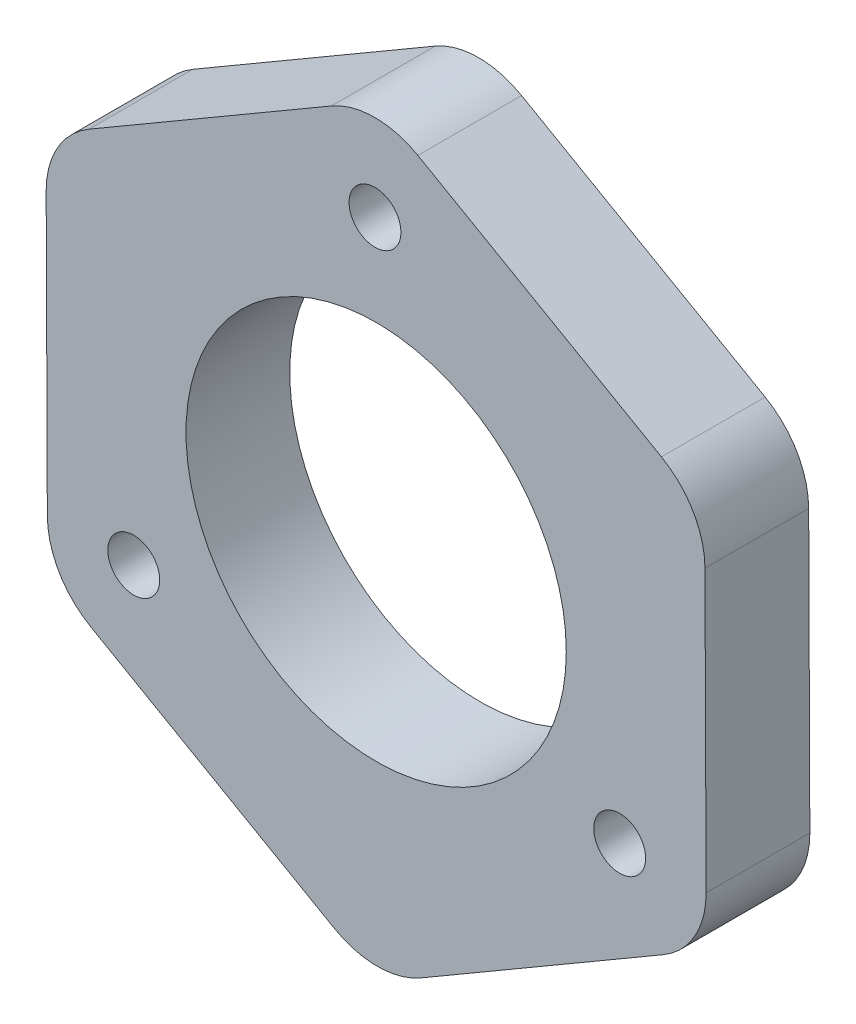
ISO-10303-21;
HEADER;
FILE_DESCRIPTION(('STEP AP214'),'2;1');
FILE_NAME('part.step','',(''),(''),'','','');
FILE_SCHEMA(('AUTOMOTIVE_DESIGN { 1 0 10303 214 1 1 1 1 }'));
ENDSEC;
DATA;
#1=APPLICATION_CONTEXT('core data for automotive mechanical design processes');
#2=APPLICATION_PROTOCOL_DEFINITION('international standard','automotive_design',2000,#1);
#3=PRODUCT_CONTEXT('',#1,'mechanical');
#4=PRODUCT('Part','Part','',(#3));
#5=PRODUCT_RELATED_PRODUCT_CATEGORY('part','',(#4));
#6=PRODUCT_DEFINITION_FORMATION('','',#4);
#7=PRODUCT_DEFINITION_CONTEXT('part definition',#1,'design');
#8=PRODUCT_DEFINITION('design','',#6,#7);
#9=PRODUCT_DEFINITION_SHAPE('','',#8);
#10=(LENGTH_UNIT() NAMED_UNIT(*) SI_UNIT(.MILLI.,.METRE.));
#11=(NAMED_UNIT(*) PLANE_ANGLE_UNIT() SI_UNIT($,.RADIAN.));
#12=(NAMED_UNIT(*) SI_UNIT($,.STERADIAN.) SOLID_ANGLE_UNIT());
#13=UNCERTAINTY_MEASURE_WITH_UNIT(LENGTH_MEASURE(1.E-05),#10,'distance_accuracy_value','');
#14=(GEOMETRIC_REPRESENTATION_CONTEXT(3) GLOBAL_UNCERTAINTY_ASSIGNED_CONTEXT((#13)) GLOBAL_UNIT_ASSIGNED_CONTEXT((#10,
#11,#12)) REPRESENTATION_CONTEXT('',''));
#15=CARTESIAN_POINT('',(0.,0.,0.));
#16=DIRECTION('',(0.,0.,1.));
#17=DIRECTION('',(1.,0.,0.));
#18=AXIS2_PLACEMENT_3D('',#15,#16,#17);
#19=CARTESIAN_POINT('',(-154.128515593109,260.310635650211,6.));
#20=DIRECTION('',(0.,0.,1.));
#21=DIRECTION('',(1.,0.,0.));
#22=AXIS2_PLACEMENT_3D('',#19,#20,#21);
#23=PLANE('',#22);
#24=CARTESIAN_POINT('',(-168.217711728864,268.367151786128,6.));
#25=DIRECTION('',(0.,0.,1.));
#26=DIRECTION('',(1.,0.,0.));
#27=AXIS2_PLACEMENT_3D('',#24,#25,#26);
#28=CIRCLE('',#27,1.50000000000191);
#29=CARTESIAN_POINT('',(-166.717711728862,268.367151786128,6.));
#30=VERTEX_POINT('',#29);
#31=EDGE_CURVE('E336',#30,#30,#28,.T.);
#32=ORIENTED_EDGE('',*,*,#31,.F.);
#33=EDGE_LOOP('',(#32));
#34=FACE_BOUND('',#33,.T.);
#35=CARTESIAN_POINT('',(-140.106761490154,268.483964952052,6.));
#36=DIRECTION('',(0.,0.,1.));
#37=DIRECTION('',(1.,0.,0.));
#38=AXIS2_PLACEMENT_3D('',#35,#36,#37);
#39=CIRCLE('',#38,1.50000000000191);
#40=CARTESIAN_POINT('',(-138.606761490152,268.483964952052,6.));
#41=VERTEX_POINT('',#40);
#42=EDGE_CURVE('E174',#41,#41,#39,.T.);
#43=ORIENTED_EDGE('',*,*,#42,.F.);
#44=EDGE_LOOP('',(#43));
#45=FACE_BOUND('',#44,.T.);
#46=CARTESIAN_POINT('',(-154.128515593109,260.310635650211,6.));
#47=DIRECTION('',(0.,0.,1.));
#48=DIRECTION('',(1.,0.,0.));
#49=AXIS2_PLACEMENT_3D('',#46,#47,#48);
#50=CIRCLE('',#49,5.00108120456059);
#51=CARTESIAN_POINT('',(-156.611036607626,255.969218528223,6.));
#52=VERTEX_POINT('',#51);
#53=CARTESIAN_POINT('',(-151.61,255.99,6.));
#54=VERTEX_POINT('',#53);
#55=EDGE_CURVE('E204',#52,#54,#50,.T.);
#56=ORIENTED_EDGE('',*,*,#55,.T.);
#57=DIRECTION('',(0.863940310801489,0.503594220948004,0.));
#58=VECTOR('',#57,1.);
#59=CARTESIAN_POINT('',(-151.61,255.99,6.));
#60=LINE('',#59,#58);
#61=CARTESIAN_POINT('',(-137.588248755692,264.163334205986,6.));
#62=VERTEX_POINT('',#61);
#63=EDGE_CURVE('E116',#54,#62,#60,.T.);
#64=ORIENTED_EDGE('',*,*,#63,.T.);
#65=CARTESIAN_POINT('',(-140.106761490154,268.483964952052,6.));
#66=DIRECTION('',(0.,0.,1.));
#67=DIRECTION('',(1.,0.,0.));
#68=AXIS2_PLACEMENT_3D('',#65,#66,#67);
#69=CIRCLE('',#68,5.00107552807404);
#70=CARTESIAN_POINT('',(-135.105729136458,268.504745586818,6.));
#71=VERTEX_POINT('',#70);
#72=EDGE_CURVE('E241',#62,#71,#69,.T.);
#73=ORIENTED_EDGE('',*,*,#72,.T.);
#74=DIRECTION('',(-0.00415523313926627,0.999991366981515,0.));
#75=VECTOR('',#74,1.);
#76=CARTESIAN_POINT('',(-135.105729136458,268.504745586818,6.));
#77=LINE('',#76,#75);
#78=CARTESIAN_POINT('',(-135.173168570308,284.734605472928,6.));
#79=VERTEX_POINT('',#78);
#80=EDGE_CURVE('E261',#71,#79,#77,.T.);
#81=ORIENTED_EDGE('',*,*,#80,.T.);
#82=CARTESIAN_POINT('',(-140.174200924005,284.713824838162,6.));
#83=DIRECTION('',(0.,0.,1.));
#84=DIRECTION('',(1.,0.,0.));
#85=AXIS2_PLACEMENT_3D('',#82,#83,#84);
#86=CIRCLE('',#85,5.00107552807402);
#87=CARTESIAN_POINT('',(-137.691684909007,289.055238279978,6.));
#88=VERTEX_POINT('',#87);
#89=EDGE_CURVE('E257',#79,#88,#86,.T.);
#90=ORIENTED_EDGE('',*,*,#89,.T.);
#91=DIRECTION('',(-0.868095956048825,0.496396425341357,0.));
#92=VECTOR('',#91,1.);
#93=CARTESIAN_POINT('',(-137.691684909007,289.055238279978,6.));
#94=LINE('',#93,#92);
#95=CARTESIAN_POINT('',(-151.780882275679,297.111752263268,6.));
#96=VERTEX_POINT('',#95);
#97=EDGE_CURVE('E260',#88,#96,#94,.T.);
#98=ORIENTED_EDGE('',*,*,#97,.T.);
#99=CARTESIAN_POINT('',(-154.263401108451,292.770333893741,6.));
#100=DIRECTION('',(0.,0.,1.));
#101=DIRECTION('',(1.,0.,0.));
#102=AXIS2_PLACEMENT_3D('',#99,#100,#101);
#103=CIRCLE('',#102,5.00108120453343);
#104=CARTESIAN_POINT('',(-156.781915285837,297.090970369151,6.));
#105=VERTEX_POINT('',#104);
#106=EDGE_CURVE('E265',#96,#105,#103,.T.);
#107=ORIENTED_EDGE('',*,*,#106,.T.);
#108=DIRECTION('',(-0.863940475810218,-0.50359393786742,0.));
#109=VECTOR('',#108,1.);
#110=CARTESIAN_POINT('',(-156.781915285837,297.090970369151,6.));
#111=LINE('',#110,#109);
#112=CARTESIAN_POINT('',(-170.803669208237,288.917640757562,6.));
#113=VERTEX_POINT('',#112);
#114=EDGE_CURVE('E272',#105,#113,#111,.T.);
#115=ORIENTED_EDGE('',*,*,#114,.T.);
#116=CARTESIAN_POINT('',(-168.285159318802,284.597011638345,6.));
#117=DIRECTION('',(0.,0.,1.));
#118=DIRECTION('',(-1.,0.,0.));
#119=AXIS2_PLACEMENT_3D('',#116,#117,#118);
#120=CIRCLE('',#119,5.00107268983456);
#121=CARTESIAN_POINT('',(-173.286188827474,284.576229376735,6.));
#122=VERTEX_POINT('',#121);
#123=EDGE_CURVE('E147',#113,#122,#120,.T.);
#124=ORIENTED_EDGE('',*,*,#123,.T.);
#125=DIRECTION('',(0.00415556079664617,-0.999991365619956,0.));
#126=VECTOR('',#125,1.);
#127=CARTESIAN_POINT('',(-173.286188827474,284.576229376735,6.));
#128=LINE('',#127,#126);
#129=CARTESIAN_POINT('',(-173.218744075744,268.346369512723,6.));
#130=VERTEX_POINT('',#129);
#131=EDGE_CURVE('E141',#122,#130,#128,.T.);
#132=ORIENTED_EDGE('',*,*,#131,.T.);
#133=CARTESIAN_POINT('',(-168.217711728864,268.367151786128,6.));
#134=DIRECTION('',(0.,0.,1.));
#135=DIRECTION('',(-1.,0.,0.));
#136=AXIS2_PLACEMENT_3D('',#133,#134,#135);
#137=CIRCLE('',#136,5.0010755280674);
#138=CARTESIAN_POINT('',(-170.700229925586,264.025739591879,6.));
#139=VERTEX_POINT('',#138);
#140=EDGE_CURVE('E145',#130,#139,#137,.T.);
#141=ORIENTED_EDGE('',*,*,#140,.T.);
#142=DIRECTION('',(0.868095706590298,-0.496396861593113,0.));
#143=VECTOR('',#142,1.);
#144=CARTESIAN_POINT('',(-170.700229925586,264.025739591879,6.));
#145=LINE('',#144,#143);
#146=EDGE_CURVE('E61',#139,#52,#145,.T.);
#147=ORIENTED_EDGE('',*,*,#146,.T.);
#148=EDGE_LOOP('',(#56,#64,#73,#81,#90,#98,#107,#115,#124,#132,#141,#147));
#149=FACE_BOUND('',#148,.T.);
#150=CARTESIAN_POINT('',(-154.263401108451,292.770333893741,6.));
#151=DIRECTION('',(0.,0.,1.));
#152=DIRECTION('',(1.,0.,0.));
#153=AXIS2_PLACEMENT_3D('',#150,#151,#152);
#154=CIRCLE('',#153,1.50000000000191);
#155=CARTESIAN_POINT('',(-152.763401108449,292.770333893741,6.));
#156=VERTEX_POINT('',#155);
#157=EDGE_CURVE('E344',#156,#156,#154,.T.);
#158=ORIENTED_EDGE('',*,*,#157,.F.);
#159=EDGE_LOOP('',(#158));
#160=FACE_BOUND('',#159,.T.);
#161=CARTESIAN_POINT('',(-154.19595766547,276.540490609328,6.));
#162=DIRECTION('',(0.,0.,1.));
#163=DIRECTION('',(1.,0.,0.));
#164=AXIS2_PLACEMENT_3D('',#161,#162,#163);
#165=CIRCLE('',#164,11.);
#166=CARTESIAN_POINT('',(-143.19595766547,276.540490609328,6.));
#167=VERTEX_POINT('',#166);
#168=EDGE_CURVE('E325',#167,#167,#165,.T.);
#169=ORIENTED_EDGE('',*,*,#168,.F.);
#170=EDGE_LOOP('',(#169));
#171=FACE_BOUND('',#170,.T.);
#172=ADVANCED_FACE('F43',(#34,#45,#149,#160,#171),#23,.T.);
#173=CARTESIAN_POINT('',(-154.128515593109,260.310635650211,0.));
#174=DIRECTION('',(0.,0.,1.));
#175=DIRECTION('',(1.,0.,0.));
#176=AXIS2_PLACEMENT_3D('',#173,#174,#175);
#177=PLANE('',#176);
#178=CARTESIAN_POINT('',(-154.128515593109,260.310635650211,0.));
#179=DIRECTION('',(0.,0.,1.));
#180=DIRECTION('',(1.,0.,0.));
#181=AXIS2_PLACEMENT_3D('',#178,#179,#180);
#182=CIRCLE('',#181,5.00108120456059);
#183=CARTESIAN_POINT('',(-156.611036607626,255.969218528223,0.));
#184=VERTEX_POINT('',#183);
#185=CARTESIAN_POINT('',(-151.61,255.99,0.));
#186=VERTEX_POINT('',#185);
#187=EDGE_CURVE('E169',#184,#186,#182,.T.);
#188=ORIENTED_EDGE('',*,*,#187,.F.);
#189=DIRECTION('',(0.868095706590298,-0.496396861593113,0.));
#190=VECTOR('',#189,1.);
#191=CARTESIAN_POINT('',(-170.700229925586,264.025739591879,0.));
#192=LINE('',#191,#190);
#193=CARTESIAN_POINT('',(-170.700229925586,264.025739591879,0.));
#194=VERTEX_POINT('',#193);
#195=EDGE_CURVE('E108',#194,#184,#192,.T.);
#196=ORIENTED_EDGE('',*,*,#195,.F.);
#197=CARTESIAN_POINT('',(-168.217711728864,268.367151786128,0.));
#198=DIRECTION('',(0.,0.,1.));
#199=DIRECTION('',(-1.,0.,0.));
#200=AXIS2_PLACEMENT_3D('',#197,#198,#199);
#201=CIRCLE('',#200,5.0010755280674);
#202=CARTESIAN_POINT('',(-173.218744075744,268.346369512723,0.));
#203=VERTEX_POINT('',#202);
#204=EDGE_CURVE('E102',#203,#194,#201,.T.);
#205=ORIENTED_EDGE('',*,*,#204,.F.);
#206=DIRECTION('',(0.00415556079664617,-0.999991365619956,0.));
#207=VECTOR('',#206,1.);
#208=CARTESIAN_POINT('',(-173.286188827474,284.576229376735,0.));
#209=LINE('',#208,#207);
#210=CARTESIAN_POINT('',(-173.286188827474,284.576229376735,0.));
#211=VERTEX_POINT('',#210);
#212=EDGE_CURVE('E156',#211,#203,#209,.T.);
#213=ORIENTED_EDGE('',*,*,#212,.F.);
#214=CARTESIAN_POINT('',(-168.285159318802,284.597011638345,0.));
#215=DIRECTION('',(0.,0.,1.));
#216=DIRECTION('',(-1.,0.,0.));
#217=AXIS2_PLACEMENT_3D('',#214,#215,#216);
#218=CIRCLE('',#217,5.00107268983456);
#219=CARTESIAN_POINT('',(-170.803669208237,288.917640757562,0.));
#220=VERTEX_POINT('',#219);
#221=EDGE_CURVE('E195',#220,#211,#218,.T.);
#222=ORIENTED_EDGE('',*,*,#221,.F.);
#223=DIRECTION('',(-0.863940475810218,-0.50359393786742,0.));
#224=VECTOR('',#223,1.);
#225=CARTESIAN_POINT('',(-156.781915285837,297.090970369151,0.));
#226=LINE('',#225,#224);
#227=CARTESIAN_POINT('',(-156.781915285837,297.090970369151,0.));
#228=VERTEX_POINT('',#227);
#229=EDGE_CURVE('E192',#228,#220,#226,.T.);
#230=ORIENTED_EDGE('',*,*,#229,.F.);
#231=CARTESIAN_POINT('',(-154.263401108451,292.770333893741,0.));
#232=DIRECTION('',(0.,0.,1.));
#233=DIRECTION('',(1.,0.,0.));
#234=AXIS2_PLACEMENT_3D('',#231,#232,#233);
#235=CIRCLE('',#234,5.00108120453343);
#236=CARTESIAN_POINT('',(-151.780882275679,297.111752263268,0.));
#237=VERTEX_POINT('',#236);
#238=EDGE_CURVE('E189',#237,#228,#235,.T.);
#239=ORIENTED_EDGE('',*,*,#238,.F.);
#240=DIRECTION('',(-0.868095956048825,0.496396425341357,0.));
#241=VECTOR('',#240,1.);
#242=CARTESIAN_POINT('',(-137.691684909007,289.055238279978,0.));
#243=LINE('',#242,#241);
#244=CARTESIAN_POINT('',(-137.691684909007,289.055238279978,0.));
#245=VERTEX_POINT('',#244);
#246=EDGE_CURVE('E186',#245,#237,#243,.T.);
#247=ORIENTED_EDGE('',*,*,#246,.F.);
#248=CARTESIAN_POINT('',(-140.174200924005,284.713824838162,0.));
#249=DIRECTION('',(0.,0.,1.));
#250=DIRECTION('',(1.,0.,0.));
#251=AXIS2_PLACEMENT_3D('',#248,#249,#250);
#252=CIRCLE('',#251,5.00107552807402);
#253=CARTESIAN_POINT('',(-135.173168570308,284.734605472928,0.));
#254=VERTEX_POINT('',#253);
#255=EDGE_CURVE('E183',#254,#245,#252,.T.);
#256=ORIENTED_EDGE('',*,*,#255,.F.);
#257=DIRECTION('',(-0.00415523313926627,0.999991366981515,0.));
#258=VECTOR('',#257,1.);
#259=CARTESIAN_POINT('',(-135.105729136458,268.504745586818,0.));
#260=LINE('',#259,#258);
#261=CARTESIAN_POINT('',(-135.105729136458,268.504745586818,0.));
#262=VERTEX_POINT('',#261);
#263=EDGE_CURVE('E180',#262,#254,#260,.T.);
#264=ORIENTED_EDGE('',*,*,#263,.F.);
#265=CARTESIAN_POINT('',(-140.106761490154,268.483964952052,0.));
#266=DIRECTION('',(0.,0.,1.));
#267=DIRECTION('',(1.,0.,0.));
#268=AXIS2_PLACEMENT_3D('',#265,#266,#267);
#269=CIRCLE('',#268,5.00107552807404);
#270=CARTESIAN_POINT('',(-137.588248755692,264.163334205986,0.));
#271=VERTEX_POINT('',#270);
#272=EDGE_CURVE('E177',#271,#262,#269,.T.);
#273=ORIENTED_EDGE('',*,*,#272,.F.);
#274=DIRECTION('',(0.863940310801489,0.503594220948004,0.));
#275=VECTOR('',#274,1.);
#276=CARTESIAN_POINT('',(-151.61,255.99,0.));
#277=LINE('',#276,#275);
#278=EDGE_CURVE('E173',#186,#271,#277,.T.);
#279=ORIENTED_EDGE('',*,*,#278,.F.);
#280=EDGE_LOOP('',(#188,#196,#205,#213,#222,#230,#239,#247,#256,#264,#273,#279));
#281=FACE_BOUND('',#280,.T.);
#282=CARTESIAN_POINT('',(-140.106761490154,268.483964952052,0.));
#283=DIRECTION('',(0.,0.,1.));
#284=DIRECTION('',(1.,0.,0.));
#285=AXIS2_PLACEMENT_3D('',#282,#283,#284);
#286=CIRCLE('',#285,1.50000000000191);
#287=CARTESIAN_POINT('',(-138.606761490152,268.483964952052,0.));
#288=VERTEX_POINT('',#287);
#289=EDGE_CURVE('E348',#288,#288,#286,.T.);
#290=ORIENTED_EDGE('',*,*,#289,.T.);
#291=EDGE_LOOP('',(#290));
#292=FACE_BOUND('',#291,.T.);
#293=CARTESIAN_POINT('',(-154.263401108451,292.770333893741,0.));
#294=DIRECTION('',(0.,0.,1.));
#295=DIRECTION('',(1.,0.,0.));
#296=AXIS2_PLACEMENT_3D('',#293,#294,#295);
#297=CIRCLE('',#296,1.50000000000191);
#298=CARTESIAN_POINT('',(-152.763401108449,292.770333893741,0.));
#299=VERTEX_POINT('',#298);
#300=EDGE_CURVE('E340',#299,#299,#297,.T.);
#301=ORIENTED_EDGE('',*,*,#300,.T.);
#302=EDGE_LOOP('',(#301));
#303=FACE_BOUND('',#302,.T.);
#304=CARTESIAN_POINT('',(-168.217711728864,268.367151786128,0.));
#305=DIRECTION('',(0.,0.,1.));
#306=DIRECTION('',(1.,0.,0.));
#307=AXIS2_PLACEMENT_3D('',#304,#305,#306);
#308=CIRCLE('',#307,1.50000000000191);
#309=CARTESIAN_POINT('',(-166.717711728862,268.367151786128,0.));
#310=VERTEX_POINT('',#309);
#311=EDGE_CURVE('E333',#310,#310,#308,.T.);
#312=ORIENTED_EDGE('',*,*,#311,.T.);
#313=EDGE_LOOP('',(#312));
#314=FACE_BOUND('',#313,.T.);
#315=CARTESIAN_POINT('',(-154.19595766547,276.540490609328,0.));
#316=DIRECTION('',(0.,0.,1.));
#317=DIRECTION('',(1.,0.,0.));
#318=AXIS2_PLACEMENT_3D('',#315,#316,#317);
#319=CIRCLE('',#318,11.);
#320=CARTESIAN_POINT('',(-143.19595766547,276.540490609328,0.));
#321=VERTEX_POINT('',#320);
#322=EDGE_CURVE('E328',#321,#321,#319,.T.);
#323=ORIENTED_EDGE('',*,*,#322,.T.);
#324=EDGE_LOOP('',(#323));
#325=FACE_BOUND('',#324,.T.);
#326=ADVANCED_FACE('F245',(#281,#292,#303,#314,#325),#177,.F.);
#327=CARTESIAN_POINT('',(-154.128515593109,260.310635650211,6.));
#328=DIRECTION('',(0.,0.,-1.));
#329=DIRECTION('',(-1.,0.,0.));
#330=AXIS2_PLACEMENT_3D('',#327,#328,#329);
#331=CYLINDRICAL_SURFACE('',#330,5.00108120456059);
#332=ORIENTED_EDGE('',*,*,#187,.T.);
#333=DIRECTION('',(0.,0.,-1.));
#334=VECTOR('',#333,1.);
#335=CARTESIAN_POINT('',(-151.61,255.99,6.));
#336=LINE('',#335,#334);
#337=EDGE_CURVE('E11',#54,#186,#336,.T.);
#338=ORIENTED_EDGE('',*,*,#337,.F.);
#339=ORIENTED_EDGE('',*,*,#55,.F.);
#340=DIRECTION('',(0.,0.,-1.));
#341=VECTOR('',#340,1.);
#342=CARTESIAN_POINT('',(-156.611036607626,255.969218528223,6.));
#343=LINE('',#342,#341);
#344=EDGE_CURVE('E165',#52,#184,#343,.T.);
#345=ORIENTED_EDGE('',*,*,#344,.T.);
#346=EDGE_LOOP('',(#332,#338,#339,#345));
#347=FACE_BOUND('',#346,.T.);
#348=ADVANCED_FACE('F45',(#347),#331,.T.);
#349=CARTESIAN_POINT('',(-151.61,255.99,6.));
#350=DIRECTION('',(-0.503594220948004,0.863940310801489,0.));
#351=DIRECTION('',(-0.863940310801489,-0.503594220948004,0.));
#352=AXIS2_PLACEMENT_3D('',#349,#350,#351);
#353=PLANE('',#352);
#354=ORIENTED_EDGE('',*,*,#278,.T.);
#355=DIRECTION('',(0.,0.,-1.));
#356=VECTOR('',#355,1.);
#357=CARTESIAN_POINT('',(-137.588248755692,264.163334205986,6.));
#358=LINE('',#357,#356);
#359=EDGE_CURVE('E53',#62,#271,#358,.T.);
#360=ORIENTED_EDGE('',*,*,#359,.F.);
#361=ORIENTED_EDGE('',*,*,#63,.F.);
#362=ORIENTED_EDGE('',*,*,#337,.T.);
#363=EDGE_LOOP('',(#354,#360,#361,#362));
#364=FACE_BOUND('',#363,.T.);
#365=ADVANCED_FACE('F474',(#364),#353,.F.);
#366=CARTESIAN_POINT('',(-140.106761490154,268.483964952052,6.));
#367=DIRECTION('',(0.,0.,-1.));
#368=DIRECTION('',(-1.,0.,0.));
#369=AXIS2_PLACEMENT_3D('',#366,#367,#368);
#370=CYLINDRICAL_SURFACE('',#369,5.00107552807404);
#371=ORIENTED_EDGE('',*,*,#272,.T.);
#372=DIRECTION('',(0.,0.,-1.));
#373=VECTOR('',#372,1.);
#374=CARTESIAN_POINT('',(-135.105729136458,268.504745586818,6.));
#375=LINE('',#374,#373);
#376=EDGE_CURVE('E231',#71,#262,#375,.T.);
#377=ORIENTED_EDGE('',*,*,#376,.F.);
#378=ORIENTED_EDGE('',*,*,#72,.F.);
#379=ORIENTED_EDGE('',*,*,#359,.T.);
#380=EDGE_LOOP('',(#371,#377,#378,#379));
#381=FACE_BOUND('',#380,.T.);
#382=ADVANCED_FACE('F239',(#381),#370,.T.);
#383=CARTESIAN_POINT('',(-135.105729136458,268.504745586818,6.));
#384=DIRECTION('',(-0.999991366981515,-0.00415523313926627,0.));
#385=DIRECTION('',(0.00415523313926627,-0.999991366981515,0.));
#386=AXIS2_PLACEMENT_3D('',#383,#384,#385);
#387=PLANE('',#386);
#388=ORIENTED_EDGE('',*,*,#263,.T.);
#389=DIRECTION('',(0.,0.,-1.));
#390=VECTOR('',#389,1.);
#391=CARTESIAN_POINT('',(-135.173168570308,284.734605472928,6.));
#392=LINE('',#391,#390);
#393=EDGE_CURVE('E227',#79,#254,#392,.T.);
#394=ORIENTED_EDGE('',*,*,#393,.F.);
#395=ORIENTED_EDGE('',*,*,#80,.F.);
#396=ORIENTED_EDGE('',*,*,#376,.T.);
#397=EDGE_LOOP('',(#388,#394,#395,#396));
#398=FACE_BOUND('',#397,.T.);
#399=ADVANCED_FACE('F251',(#398),#387,.F.);
#400=CARTESIAN_POINT('',(-140.174200924005,284.713824838162,6.));
#401=DIRECTION('',(0.,0.,-1.));
#402=DIRECTION('',(-1.,0.,0.));
#403=AXIS2_PLACEMENT_3D('',#400,#401,#402);
#404=CYLINDRICAL_SURFACE('',#403,5.00107552807402);
#405=ORIENTED_EDGE('',*,*,#255,.T.);
#406=DIRECTION('',(0.,0.,-1.));
#407=VECTOR('',#406,1.);
#408=CARTESIAN_POINT('',(-137.691684909007,289.055238279978,6.));
#409=LINE('',#408,#407);
#410=EDGE_CURVE('E223',#88,#245,#409,.T.);
#411=ORIENTED_EDGE('',*,*,#410,.F.);
#412=ORIENTED_EDGE('',*,*,#89,.F.);
#413=ORIENTED_EDGE('',*,*,#393,.T.);
#414=EDGE_LOOP('',(#405,#411,#412,#413));
#415=FACE_BOUND('',#414,.T.);
#416=ADVANCED_FACE('F255',(#415),#404,.T.);
#417=CARTESIAN_POINT('',(-137.691684909007,289.055238279978,6.));
#418=DIRECTION('',(-0.496396425341357,-0.868095956048825,0.));
#419=DIRECTION('',(0.868095956048825,-0.496396425341357,0.));
#420=AXIS2_PLACEMENT_3D('',#417,#418,#419);
#421=PLANE('',#420);
#422=ORIENTED_EDGE('',*,*,#246,.T.);
#423=DIRECTION('',(0.,0.,-1.));
#424=VECTOR('',#423,1.);
#425=CARTESIAN_POINT('',(-151.780882275679,297.111752263268,6.));
#426=LINE('',#425,#424);
#427=EDGE_CURVE('E219',#96,#237,#426,.T.);
#428=ORIENTED_EDGE('',*,*,#427,.F.);
#429=ORIENTED_EDGE('',*,*,#97,.F.);
#430=ORIENTED_EDGE('',*,*,#410,.T.);
#431=EDGE_LOOP('',(#422,#428,#429,#430));
#432=FACE_BOUND('',#431,.T.);
#433=ADVANCED_FACE('F435',(#432),#421,.F.);
#434=CARTESIAN_POINT('',(-154.263401108451,292.770333893741,6.));
#435=DIRECTION('',(0.,0.,-1.));
#436=DIRECTION('',(-1.,0.,0.));
#437=AXIS2_PLACEMENT_3D('',#434,#435,#436);
#438=CYLINDRICAL_SURFACE('',#437,5.00108120453343);
#439=ORIENTED_EDGE('',*,*,#238,.T.);
#440=DIRECTION('',(0.,0.,-1.));
#441=VECTOR('',#440,1.);
#442=CARTESIAN_POINT('',(-156.781915285837,297.090970369151,6.));
#443=LINE('',#442,#441);
#444=EDGE_CURVE('E215',#105,#228,#443,.T.);
#445=ORIENTED_EDGE('',*,*,#444,.F.);
#446=ORIENTED_EDGE('',*,*,#106,.F.);
#447=ORIENTED_EDGE('',*,*,#427,.T.);
#448=EDGE_LOOP('',(#439,#445,#446,#447));
#449=FACE_BOUND('',#448,.T.);
#450=ADVANCED_FACE('F425',(#449),#438,.T.);
#451=CARTESIAN_POINT('',(-156.781915285837,297.090970369151,6.));
#452=DIRECTION('',(0.50359393786742,-0.863940475810218,0.));
#453=DIRECTION('',(0.863940475810218,0.50359393786742,0.));
#454=AXIS2_PLACEMENT_3D('',#451,#452,#453);
#455=PLANE('',#454);
#456=ORIENTED_EDGE('',*,*,#229,.T.);
#457=DIRECTION('',(0.,0.,-1.));
#458=VECTOR('',#457,1.);
#459=CARTESIAN_POINT('',(-170.803669208237,288.917640757562,6.));
#460=LINE('',#459,#458);
#461=EDGE_CURVE('E211',#113,#220,#460,.T.);
#462=ORIENTED_EDGE('',*,*,#461,.F.);
#463=ORIENTED_EDGE('',*,*,#114,.F.);
#464=ORIENTED_EDGE('',*,*,#444,.T.);
#465=EDGE_LOOP('',(#456,#462,#463,#464));
#466=FACE_BOUND('',#465,.T.);
#467=ADVANCED_FACE('F280',(#466),#455,.F.);
#468=CARTESIAN_POINT('',(-168.285159318802,284.597011638345,6.));
#469=DIRECTION('',(0.,0.,-1.));
#470=DIRECTION('',(-1.,0.,0.));
#471=AXIS2_PLACEMENT_3D('',#468,#469,#470);
#472=CYLINDRICAL_SURFACE('',#471,5.00107268983456);
#473=ORIENTED_EDGE('',*,*,#221,.T.);
#474=DIRECTION('',(0.,0.,-1.));
#475=VECTOR('',#474,1.);
#476=CARTESIAN_POINT('',(-173.286188827474,284.576229376735,6.));
#477=LINE('',#476,#475);
#478=EDGE_CURVE('E158',#122,#211,#477,.T.);
#479=ORIENTED_EDGE('',*,*,#478,.F.);
#480=ORIENTED_EDGE('',*,*,#123,.F.);
#481=ORIENTED_EDGE('',*,*,#461,.T.);
#482=EDGE_LOOP('',(#473,#479,#480,#481));
#483=FACE_BOUND('',#482,.T.);
#484=ADVANCED_FACE('F284',(#483),#472,.T.);
#485=CARTESIAN_POINT('',(-173.286188827474,284.576229376735,6.));
#486=DIRECTION('',(0.999991365619956,0.00415556079664617,0.));
#487=DIRECTION('',(-0.00415556079664617,0.999991365619957,0.));
#488=AXIS2_PLACEMENT_3D('',#485,#486,#487);
#489=PLANE('',#488);
#490=ORIENTED_EDGE('',*,*,#212,.T.);
#491=DIRECTION('',(0.,0.,-1.));
#492=VECTOR('',#491,1.);
#493=CARTESIAN_POINT('',(-173.218744075744,268.346369512723,6.));
#494=LINE('',#493,#492);
#495=EDGE_CURVE('E153',#130,#203,#494,.T.);
#496=ORIENTED_EDGE('',*,*,#495,.F.);
#497=ORIENTED_EDGE('',*,*,#131,.F.);
#498=ORIENTED_EDGE('',*,*,#478,.T.);
#499=EDGE_LOOP('',(#490,#496,#497,#498));
#500=FACE_BOUND('',#499,.T.);
#501=ADVANCED_FACE('F154',(#500),#489,.F.);
#502=CARTESIAN_POINT('',(-168.217711728864,268.367151786128,6.));
#503=DIRECTION('',(0.,0.,-1.));
#504=DIRECTION('',(-1.,0.,0.));
#505=AXIS2_PLACEMENT_3D('',#502,#503,#504);
#506=CYLINDRICAL_SURFACE('',#505,5.0010755280674);
#507=ORIENTED_EDGE('',*,*,#204,.T.);
#508=DIRECTION('',(0.,0.,-1.));
#509=VECTOR('',#508,1.);
#510=CARTESIAN_POINT('',(-170.700229925586,264.025739591879,6.));
#511=LINE('',#510,#509);
#512=EDGE_CURVE('E159',#139,#194,#511,.T.);
#513=ORIENTED_EDGE('',*,*,#512,.F.);
#514=ORIENTED_EDGE('',*,*,#140,.F.);
#515=ORIENTED_EDGE('',*,*,#495,.T.);
#516=EDGE_LOOP('',(#507,#513,#514,#515));
#517=FACE_BOUND('',#516,.T.);
#518=ADVANCED_FACE('F161',(#517),#506,.T.);
#519=CARTESIAN_POINT('',(-170.700229925586,264.025739591879,6.));
#520=DIRECTION('',(0.496396861593113,0.868095706590298,0.));
#521=DIRECTION('',(-0.868095706590298,0.496396861593113,0.));
#522=AXIS2_PLACEMENT_3D('',#519,#520,#521);
#523=PLANE('',#522);
#524=ORIENTED_EDGE('',*,*,#195,.T.);
#525=ORIENTED_EDGE('',*,*,#344,.F.);
#526=ORIENTED_EDGE('',*,*,#146,.F.);
#527=ORIENTED_EDGE('',*,*,#512,.T.);
#528=EDGE_LOOP('',(#524,#525,#526,#527));
#529=FACE_BOUND('',#528,.T.);
#530=ADVANCED_FACE('F288',(#529),#523,.F.);
#531=CARTESIAN_POINT('',(-140.106761490154,268.483964952052,6.));
#532=DIRECTION('',(0.,0.,-1.));
#533=DIRECTION('',(-1.,0.,0.));
#534=AXIS2_PLACEMENT_3D('',#531,#532,#533);
#535=CYLINDRICAL_SURFACE('',#534,1.50000000000191);
#536=ORIENTED_EDGE('',*,*,#42,.T.);
#537=EDGE_LOOP('',(#536));
#538=FACE_BOUND('',#537,.T.);
#539=ORIENTED_EDGE('',*,*,#289,.F.);
#540=EDGE_LOOP('',(#539));
#541=FACE_BOUND('',#540,.T.);
#542=ADVANCED_FACE('F290',(#538,#541),#535,.F.);
#543=CARTESIAN_POINT('',(-154.263401108451,292.770333893741,6.));
#544=DIRECTION('',(0.,0.,-1.));
#545=DIRECTION('',(-1.,0.,0.));
#546=AXIS2_PLACEMENT_3D('',#543,#544,#545);
#547=CYLINDRICAL_SURFACE('',#546,1.50000000000191);
#548=ORIENTED_EDGE('',*,*,#157,.T.);
#549=EDGE_LOOP('',(#548));
#550=FACE_BOUND('',#549,.T.);
#551=ORIENTED_EDGE('',*,*,#300,.F.);
#552=EDGE_LOOP('',(#551));
#553=FACE_BOUND('',#552,.T.);
#554=ADVANCED_FACE('F296',(#550,#553),#547,.F.);
#555=CARTESIAN_POINT('',(-168.217711728864,268.367151786128,6.));
#556=DIRECTION('',(0.,0.,-1.));
#557=DIRECTION('',(-1.,0.,0.));
#558=AXIS2_PLACEMENT_3D('',#555,#556,#557);
#559=CYLINDRICAL_SURFACE('',#558,1.50000000000191);
#560=ORIENTED_EDGE('',*,*,#31,.T.);
#561=EDGE_LOOP('',(#560));
#562=FACE_BOUND('',#561,.T.);
#563=ORIENTED_EDGE('',*,*,#311,.F.);
#564=EDGE_LOOP('',(#563));
#565=FACE_BOUND('',#564,.T.);
#566=ADVANCED_FACE('F312',(#562,#565),#559,.F.);
#567=CARTESIAN_POINT('',(-154.19595766547,276.540490609328,6.));
#568=DIRECTION('',(0.,0.,-1.));
#569=DIRECTION('',(-1.,0.,0.));
#570=AXIS2_PLACEMENT_3D('',#567,#568,#569);
#571=CYLINDRICAL_SURFACE('',#570,11.);
#572=ORIENTED_EDGE('',*,*,#168,.T.);
#573=EDGE_LOOP('',(#572));
#574=FACE_BOUND('',#573,.T.);
#575=ORIENTED_EDGE('',*,*,#322,.F.);
#576=EDGE_LOOP('',(#575));
#577=FACE_BOUND('',#576,.T.);
#578=ADVANCED_FACE('F316',(#574,#577),#571,.F.);
#579=CLOSED_SHELL('',(#172,#326,#348,#365,#382,#399,#416,#433,#450,#467,#484,#501,#518,#530,
#542,#554,#566,#578));
#580=MANIFOLD_SOLID_BREP('B2',#579);
#581=ADVANCED_BREP_SHAPE_REPRESENTATION('',(#18,#580),#14);
#582=SHAPE_DEFINITION_REPRESENTATION(#9,#581);
ENDSEC;
END-ISO-10303-21;
